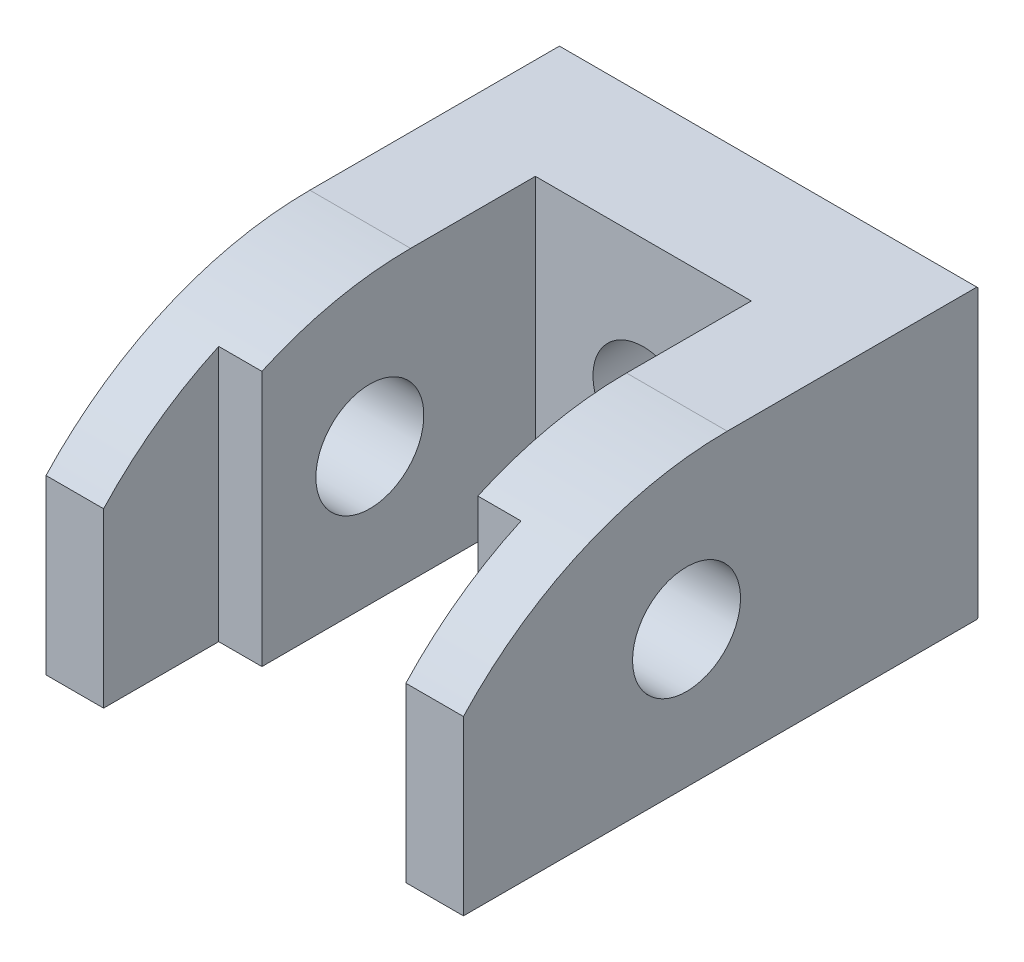
ISO-10303-21;
HEADER;
FILE_DESCRIPTION(('STEP AP214'),'2;1');
FILE_NAME('part.step','',(''),(''),'','','');
FILE_SCHEMA(('AUTOMOTIVE_DESIGN { 1 0 10303 214 1 1 1 1 }'));
ENDSEC;
DATA;
#1=APPLICATION_CONTEXT('core data for automotive mechanical design processes');
#2=APPLICATION_PROTOCOL_DEFINITION('international standard','automotive_design',2000,#1);
#3=PRODUCT_CONTEXT('',#1,'mechanical');
#4=PRODUCT('Part','Part','',(#3));
#5=PRODUCT_RELATED_PRODUCT_CATEGORY('part','',(#4));
#6=PRODUCT_DEFINITION_FORMATION('','',#4);
#7=PRODUCT_DEFINITION_CONTEXT('part definition',#1,'design');
#8=PRODUCT_DEFINITION('design','',#6,#7);
#9=PRODUCT_DEFINITION_SHAPE('','',#8);
#10=(LENGTH_UNIT() NAMED_UNIT(*) SI_UNIT(.MILLI.,.METRE.));
#11=(NAMED_UNIT(*) PLANE_ANGLE_UNIT() SI_UNIT($,.RADIAN.));
#12=(NAMED_UNIT(*) SI_UNIT($,.STERADIAN.) SOLID_ANGLE_UNIT());
#13=UNCERTAINTY_MEASURE_WITH_UNIT(LENGTH_MEASURE(1.E-05),#10,'distance_accuracy_value','');
#14=(GEOMETRIC_REPRESENTATION_CONTEXT(3) GLOBAL_UNCERTAINTY_ASSIGNED_CONTEXT((#13)) GLOBAL_UNIT_ASSIGNED_CONTEXT((#10,
#11,#12)) REPRESENTATION_CONTEXT('',''));
#15=CARTESIAN_POINT('',(0.,0.,0.));
#16=DIRECTION('',(0.,0.,1.));
#17=DIRECTION('',(1.,0.,0.));
#18=AXIS2_PLACEMENT_3D('',#15,#16,#17);
#19=CARTESIAN_POINT('',(0.,-10.,-71.5));
#20=DIRECTION('',(0.707106781186547,0.,0.707106781186548));
#21=DIRECTION('',(0.,-1.,0.));
#22=AXIS2_PLACEMENT_3D('',#19,#20,#21);
#23=PLANE('',#22);
#24=DIRECTION('',(0.,-1.,0.));
#25=VECTOR('',#24,1.);
#26=CARTESIAN_POINT('',(0.,-10.,-71.5));
#27=LINE('',#26,#25);
#28=CARTESIAN_POINT('',(0.,39.8397459621556,-71.5));
#29=VERTEX_POINT('',#28);
#30=CARTESIAN_POINT('',(0.,0.160254037844376,-71.5));
#31=VERTEX_POINT('',#30);
#32=EDGE_CURVE('E382',#29,#31,#27,.T.);
#33=ORIENTED_EDGE('',*,*,#32,.F.);
#34=DIRECTION('',(-0.577350269189625,0.577350269189627,0.577350269189625));
#35=VECTOR('',#34,1.);
#36=CARTESIAN_POINT('',(16.6132486540519,23.2264973081037,-88.1132486540519));
#37=LINE('',#36,#35);
#38=CARTESIAN_POINT('',(8.50000000000001,31.3397459621556,-80.));
#39=VERTEX_POINT('',#38);
#40=EDGE_CURVE('E60',#39,#29,#37,.T.);
#41=ORIENTED_EDGE('',*,*,#40,.F.);
#42=DIRECTION('',(0.,1.,0.));
#43=VECTOR('',#42,1.);
#44=CARTESIAN_POINT('',(8.5,8.66025403784441,-80.));
#45=LINE('',#44,#43);
#46=CARTESIAN_POINT('',(8.50000000000001,8.66025403784441,-80.));
#47=VERTEX_POINT('',#46);
#48=EDGE_CURVE('E386',#47,#39,#45,.T.);
#49=ORIENTED_EDGE('',*,*,#48,.F.);
#50=DIRECTION('',(0.577350269189625,0.577350269189627,-0.577350269189625));
#51=VECTOR('',#50,1.);
#52=CARTESIAN_POINT('',(-3.38675134594814,-3.22649730810376,-68.1132486540519));
#53=LINE('',#52,#51);
#54=EDGE_CURVE('E13',#31,#47,#53,.T.);
#55=ORIENTED_EDGE('',*,*,#54,.F.);
#56=EDGE_LOOP('',(#33,#41,#49,#55));
#57=FACE_BOUND('',#56,.T.);
#58=ADVANCED_FACE('F51',(#57),#23,.F.);
#59=CARTESIAN_POINT('',(49.5,8.66025403784441,-80.));
#60=DIRECTION('',(0.707106781186547,0.,-0.707106781186548));
#61=DIRECTION('',(0.,1.,0.));
#62=AXIS2_PLACEMENT_3D('',#59,#60,#61);
#63=PLANE('',#62);
#64=DIRECTION('',(0.,-1.,0.));
#65=VECTOR('',#64,1.);
#66=CARTESIAN_POINT('',(49.5,31.3397459621556,-80.));
#67=LINE('',#66,#65);
#68=CARTESIAN_POINT('',(49.5,31.3397459621556,-80.));
#69=VERTEX_POINT('',#68);
#70=CARTESIAN_POINT('',(49.5,8.66025403784441,-80.));
#71=VERTEX_POINT('',#70);
#72=EDGE_CURVE('E350',#69,#71,#67,.T.);
#73=ORIENTED_EDGE('',*,*,#72,.F.);
#74=DIRECTION('',(0.577350269189625,0.577350269189627,0.577350269189625));
#75=VECTOR('',#74,1.);
#76=CARTESIAN_POINT('',(41.9401693585629,23.7799153207185,-87.5598306414371));
#77=LINE('',#76,#75);
#78=CARTESIAN_POINT('',(58.,39.8397459621556,-71.5));
#79=VERTEX_POINT('',#78);
#80=EDGE_CURVE('E376',#79,#69,#77,.F.);
#81=ORIENTED_EDGE('',*,*,#80,.F.);
#82=DIRECTION('',(0.,1.,0.));
#83=VECTOR('',#82,1.);
#84=CARTESIAN_POINT('',(58.,31.3397459621556,-71.5));
#85=LINE('',#84,#83);
#86=CARTESIAN_POINT('',(58.,0.160254037844376,-71.5));
#87=VERTEX_POINT('',#86);
#88=EDGE_CURVE('E372',#87,#79,#85,.T.);
#89=ORIENTED_EDGE('',*,*,#88,.F.);
#90=DIRECTION('',(-0.577350269189625,0.577350269189627,-0.577350269189625));
#91=VECTOR('',#90,1.);
#92=CARTESIAN_POINT('',(49.5,8.66025403784441,-80.));
#93=LINE('',#92,#91);
#94=EDGE_CURVE('E379',#71,#87,#93,.F.);
#95=ORIENTED_EDGE('',*,*,#94,.F.);
#96=EDGE_LOOP('',(#73,#81,#89,#95));
#97=FACE_BOUND('',#96,.T.);
#98=ADVANCED_FACE('F409',(#97),#63,.T.);
#99=CARTESIAN_POINT('',(58.,-10.,-36.6606055596467));
#100=DIRECTION('',(-1.,0.,0.));
#101=DIRECTION('',(0.,0.,1.));
#102=AXIS2_PLACEMENT_3D('',#99,#100,#101);
#103=CYLINDRICAL_SURFACE('',#102,50.);
#104=DIRECTION('',(-1.,0.,0.));
#105=VECTOR('',#104,1.);
#106=CARTESIAN_POINT('',(58.,35.5317403347236,-16.));
#107=LINE('',#106,#105);
#108=CARTESIAN_POINT('',(44.,35.5317403347236,-16.));
#109=VERTEX_POINT('',#108);
#110=CARTESIAN_POINT('',(50.,35.5317403347236,-16.));
#111=VERTEX_POINT('',#110);
#112=EDGE_CURVE('E346',#109,#111,#107,.F.);
#113=ORIENTED_EDGE('',*,*,#112,.T.);
#114=CARTESIAN_POINT('',(50.,-10.,-36.6606055596467));
#115=DIRECTION('',(1.,0.,0.));
#116=DIRECTION('',(0.,0.,-1.));
#117=AXIS2_PLACEMENT_3D('',#114,#115,#116);
#118=CIRCLE('',#117,50.);
#119=CARTESIAN_POINT('',(50.,24.,0.));
#120=VERTEX_POINT('',#119);
#121=EDGE_CURVE('E256',#111,#120,#118,.T.);
#122=ORIENTED_EDGE('',*,*,#121,.T.);
#123=DIRECTION('',(-1.,0.,0.));
#124=VECTOR('',#123,1.);
#125=CARTESIAN_POINT('',(58.,24.,0.));
#126=LINE('',#125,#124);
#127=CARTESIAN_POINT('',(58.,24.,0.));
#128=VERTEX_POINT('',#127);
#129=EDGE_CURVE('E310',#128,#120,#126,.T.);
#130=ORIENTED_EDGE('',*,*,#129,.F.);
#131=CARTESIAN_POINT('',(58.,-10.,-36.6606055596467));
#132=DIRECTION('',(1.,0.,0.));
#133=DIRECTION('',(0.,0.,-1.));
#134=AXIS2_PLACEMENT_3D('',#131,#132,#133);
#135=CIRCLE('',#134,50.);
#136=CARTESIAN_POINT('',(58.,40.,-36.6606055596467));
#137=VERTEX_POINT('',#136);
#138=EDGE_CURVE('E282',#137,#128,#135,.T.);
#139=ORIENTED_EDGE('',*,*,#138,.F.);
#140=DIRECTION('',(-1.,0.,0.));
#141=VECTOR('',#140,1.);
#142=CARTESIAN_POINT('',(58.,40.,-36.6606055596467));
#143=LINE('',#142,#141);
#144=CARTESIAN_POINT('',(44.,40.,-36.6606055596467));
#145=VERTEX_POINT('',#144);
#146=EDGE_CURVE('E314',#137,#145,#143,.T.);
#147=ORIENTED_EDGE('',*,*,#146,.T.);
#148=CARTESIAN_POINT('',(44.,-10.,-36.6606055596467));
#149=DIRECTION('',(1.,0.,0.));
#150=DIRECTION('',(0.,0.,-1.));
#151=AXIS2_PLACEMENT_3D('',#148,#149,#150);
#152=CIRCLE('',#151,50.);
#153=EDGE_CURVE('E252',#145,#109,#152,.T.);
#154=ORIENTED_EDGE('',*,*,#153,.T.);
#155=EDGE_LOOP('',(#113,#122,#130,#139,#147,#154));
#156=FACE_BOUND('',#155,.T.);
#157=ADVANCED_FACE('F443',(#156),#103,.T.);
#158=CARTESIAN_POINT('',(58.,0.,0.));
#159=DIRECTION('',(0.,0.,-1.));
#160=DIRECTION('',(-1.,0.,0.));
#161=AXIS2_PLACEMENT_3D('',#158,#159,#160);
#162=PLANE('',#161);
#163=DIRECTION('',(-1.,0.,0.));
#164=VECTOR('',#163,1.);
#165=CARTESIAN_POINT('',(58.,0.,0.));
#166=LINE('',#165,#164);
#167=CARTESIAN_POINT('',(8.,0.,0.));
#168=VERTEX_POINT('',#167);
#169=CARTESIAN_POINT('',(0.,0.,0.));
#170=VERTEX_POINT('',#169);
#171=EDGE_CURVE('E289',#168,#170,#166,.T.);
#172=ORIENTED_EDGE('',*,*,#171,.F.);
#173=DIRECTION('',(0.,1.,0.));
#174=VECTOR('',#173,1.);
#175=CARTESIAN_POINT('',(8.,0.,0.));
#176=LINE('',#175,#174);
#177=CARTESIAN_POINT('',(8.,24.,0.));
#178=VERTEX_POINT('',#177);
#179=EDGE_CURVE('E338',#168,#178,#176,.T.);
#180=ORIENTED_EDGE('',*,*,#179,.T.);
#181=CARTESIAN_POINT('',(0.,24.,0.));
#182=VERTEX_POINT('',#181);
#183=EDGE_CURVE('E309',#178,#182,#126,.T.);
#184=ORIENTED_EDGE('',*,*,#183,.T.);
#185=DIRECTION('',(0.,-1.,0.));
#186=VECTOR('',#185,1.);
#187=CARTESIAN_POINT('',(0.,0.,0.));
#188=LINE('',#187,#186);
#189=EDGE_CURVE('E278',#182,#170,#188,.T.);
#190=ORIENTED_EDGE('',*,*,#189,.T.);
#191=EDGE_LOOP('',(#172,#180,#184,#190));
#192=FACE_BOUND('',#191,.T.);
#193=ADVANCED_FACE('F424',(#192),#162,.F.);
#194=CARTESIAN_POINT('',(58.,19.,-31.));
#195=DIRECTION('',(-1.,0.,0.));
#196=DIRECTION('',(0.,0.,1.));
#197=AXIS2_PLACEMENT_3D('',#194,#195,#196);
#198=CYLINDRICAL_SURFACE('',#197,7.5);
#199=CARTESIAN_POINT('',(44.,19.,-31.));
#200=DIRECTION('',(1.,0.,0.));
#201=DIRECTION('',(0.,0.,-1.));
#202=AXIS2_PLACEMENT_3D('',#199,#200,#201);
#203=CIRCLE('',#202,7.5);
#204=CARTESIAN_POINT('',(44.,19.,-23.5));
#205=VERTEX_POINT('',#204);
#206=EDGE_CURVE('E251',#205,#205,#203,.T.);
#207=CARTESIAN_POINT('',(58.,19.,-31.));
#208=DIRECTION('',(1.,0.,0.));
#209=DIRECTION('',(0.,0.,-1.));
#210=AXIS2_PLACEMENT_3D('',#207,#208,#209);
#211=CIRCLE('',#210,7.5);
#212=CARTESIAN_POINT('',(58.,19.,-23.5));
#213=VERTEX_POINT('',#212);
#214=EDGE_CURVE('E265',#213,#213,#211,.T.);
#215=CARTESIAN_POINT('',(44.,19.,-23.5));
#216=CARTESIAN_POINT('',(44.1458333333333,19.,-23.5));
#217=CARTESIAN_POINT('',(44.2916666666667,19.,-23.5));
#218=CARTESIAN_POINT('',(44.5833333333333,19.,-23.5));
#219=CARTESIAN_POINT('',(44.7291666666667,19.,-23.5));
#220=CARTESIAN_POINT('',(45.0208333333333,19.,-23.5));
#221=CARTESIAN_POINT('',(45.1666666666667,19.,-23.5));
#222=CARTESIAN_POINT('',(45.4583333333333,19.,-23.5));
#223=CARTESIAN_POINT('',(45.6041666666667,19.,-23.5));
#224=CARTESIAN_POINT('',(45.8958333333333,19.,-23.5));
#225=CARTESIAN_POINT('',(46.0416666666667,19.,-23.5));
#226=CARTESIAN_POINT('',(46.3333333333333,19.,-23.5));
#227=CARTESIAN_POINT('',(46.4791666666667,19.,-23.5));
#228=CARTESIAN_POINT('',(46.7708333333333,19.,-23.5));
#229=CARTESIAN_POINT('',(46.9166666666667,19.,-23.5));
#230=CARTESIAN_POINT('',(47.2083333333333,19.,-23.5));
#231=CARTESIAN_POINT('',(47.3541666666667,19.,-23.5));
#232=CARTESIAN_POINT('',(47.6458333333333,19.,-23.5));
#233=CARTESIAN_POINT('',(47.7916666666667,19.,-23.5));
#234=CARTESIAN_POINT('',(48.0833333333333,19.,-23.5));
#235=CARTESIAN_POINT('',(48.2291666666667,19.,-23.5));
#236=CARTESIAN_POINT('',(48.5208333333333,19.,-23.5));
#237=CARTESIAN_POINT('',(48.6666666666667,19.,-23.5));
#238=CARTESIAN_POINT('',(48.9583333333333,19.,-23.5));
#239=CARTESIAN_POINT('',(49.1041666666667,19.,-23.5));
#240=CARTESIAN_POINT('',(49.3958333333333,19.,-23.5));
#241=CARTESIAN_POINT('',(49.5416666666667,19.,-23.5));
#242=CARTESIAN_POINT('',(49.8333333333333,19.,-23.5));
#243=CARTESIAN_POINT('',(49.9791666666667,19.,-23.5));
#244=CARTESIAN_POINT('',(50.2708333333333,19.,-23.5));
#245=CARTESIAN_POINT('',(50.4166666666667,19.,-23.5));
#246=CARTESIAN_POINT('',(50.7083333333333,19.,-23.5));
#247=CARTESIAN_POINT('',(50.8541666666667,19.,-23.5));
#248=CARTESIAN_POINT('',(51.1458333333333,19.,-23.5));
#249=CARTESIAN_POINT('',(51.2916666666667,19.,-23.5));
#250=CARTESIAN_POINT('',(51.5833333333333,19.,-23.5));
#251=CARTESIAN_POINT('',(51.7291666666667,19.,-23.5));
#252=CARTESIAN_POINT('',(52.0208333333333,19.,-23.5));
#253=CARTESIAN_POINT('',(52.1666666666667,19.,-23.5));
#254=CARTESIAN_POINT('',(52.4583333333333,19.,-23.5));
#255=CARTESIAN_POINT('',(52.6041666666667,19.,-23.5));
#256=CARTESIAN_POINT('',(52.8958333333333,19.,-23.5));
#257=CARTESIAN_POINT('',(53.0416666666667,19.,-23.5));
#258=CARTESIAN_POINT('',(53.3333333333333,19.,-23.5));
#259=CARTESIAN_POINT('',(53.4791666666667,19.,-23.5));
#260=CARTESIAN_POINT('',(53.7708333333333,19.,-23.5));
#261=CARTESIAN_POINT('',(53.9166666666667,19.,-23.5));
#262=CARTESIAN_POINT('',(54.2083333333333,19.,-23.5));
#263=CARTESIAN_POINT('',(54.3541666666667,19.,-23.5));
#264=CARTESIAN_POINT('',(54.6458333333333,19.,-23.5));
#265=CARTESIAN_POINT('',(54.7916666666667,19.,-23.5));
#266=CARTESIAN_POINT('',(55.0833333333333,19.,-23.5));
#267=CARTESIAN_POINT('',(55.2291666666667,19.,-23.5));
#268=CARTESIAN_POINT('',(55.5208333333333,19.,-23.5));
#269=CARTESIAN_POINT('',(55.6666666666667,19.,-23.5));
#270=CARTESIAN_POINT('',(55.9583333333333,19.,-23.5));
#271=CARTESIAN_POINT('',(56.1041666666667,19.,-23.5));
#272=CARTESIAN_POINT('',(56.3958333333333,19.,-23.5));
#273=CARTESIAN_POINT('',(56.5416666666667,19.,-23.5));
#274=CARTESIAN_POINT('',(56.8333333333333,19.,-23.5));
#275=CARTESIAN_POINT('',(56.9791666666667,19.,-23.5));
#276=CARTESIAN_POINT('',(57.2708333333333,19.,-23.5));
#277=CARTESIAN_POINT('',(57.4166666666667,19.,-23.5));
#278=CARTESIAN_POINT('',(57.7083333333333,19.,-23.5));
#279=CARTESIAN_POINT('',(57.8541666666667,19.,-23.5));
#280=CARTESIAN_POINT('',(58.,19.,-23.5));
#281=B_SPLINE_CURVE_WITH_KNOTS('',3,(#215,#216,#217,#218,#219,#220,#221,#222,#223,#224,#225,
#226,#227,#228,#229,#230,#231,#232,#233,#234,#235,#236,#237,#238,#239,#240,#241,#242,#243,#244,
#245,#246,#247,#248,#249,#250,#251,#252,#253,#254,#255,#256,#257,#258,#259,#260,#261,#262,#263,
#264,#265,#266,#267,#268,#269,#270,#271,#272,#273,#274,#275,#276,#277,#278,#279,#280),
.UNSPECIFIED.,.F.,.F.,(4,2,2,2,2,2,2,2,2,2,2,2,2,2,2,2,2,2,2,2,2,2,2,2,2,2,2,2,2,2,2,2,4),(0.,
0.4375,0.875000000000001,1.3125,1.75,2.1875,2.625,3.0625,3.5,3.9375,4.375,4.8125,5.25,5.6875,
6.125,6.5625,7.,7.4375,7.875,8.3125,8.75,9.18749999999999,9.62499999999999,10.0625,10.5,10.9375,
11.375,11.8125,12.25,12.6875,13.125,13.5625,14.),.UNSPECIFIED.);
#282=EDGE_CURVE('BSEAM463',#205,#213,#281,.T.);
#283=ORIENTED_EDGE('',*,*,#206,.F.);
#284=ORIENTED_EDGE('',*,*,#214,.T.);
#285=ORIENTED_EDGE('',*,*,#282,.T.);
#286=ORIENTED_EDGE('',*,*,#282,.F.);
#287=EDGE_LOOP('',(#283,#285,#284,#286));
#288=FACE_BOUND('',#287,.T.);
#289=ADVANCED_FACE('F463',(#288),#198,.F.);
#290=CARTESIAN_POINT('',(58.,-10.,-36.6606055596467));
#291=DIRECTION('',(1.,0.,0.));
#292=DIRECTION('',(0.,0.,-1.));
#293=AXIS2_PLACEMENT_3D('',#290,#291,#292);
#294=PLANE('',#293);
#295=DIRECTION('',(0.,-0.707106781186549,0.707106781186546));
#296=VECTOR('',#295,1.);
#297=CARTESIAN_POINT('',(58.,8.66025403784441,-80.));
#298=LINE('',#297,#296);
#299=CARTESIAN_POINT('',(58.,0.,-71.3397459621556));
#300=VERTEX_POINT('',#299);
#301=EDGE_CURVE('E277',#300,#87,#298,.F.);
#302=ORIENTED_EDGE('',*,*,#301,.T.);
#303=ORIENTED_EDGE('',*,*,#88,.T.);
#304=DIRECTION('',(0.,-0.707106781186549,-0.707106781186546));
#305=VECTOR('',#304,1.);
#306=CARTESIAN_POINT('',(58.,31.3397459621556,-80.));
#307=LINE('',#306,#305);
#308=CARTESIAN_POINT('',(58.,40.,-71.3397459621556));
#309=VERTEX_POINT('',#308);
#310=EDGE_CURVE('E283',#79,#309,#307,.F.);
#311=ORIENTED_EDGE('',*,*,#310,.T.);
#312=DIRECTION('',(0.,0.,1.));
#313=VECTOR('',#312,1.);
#314=CARTESIAN_POINT('',(58.,40.,-65.));
#315=LINE('',#314,#313);
#316=EDGE_CURVE('E279',#309,#137,#315,.T.);
#317=ORIENTED_EDGE('',*,*,#316,.T.);
#318=ORIENTED_EDGE('',*,*,#138,.T.);
#319=DIRECTION('',(0.,-1.,0.));
#320=VECTOR('',#319,1.);
#321=CARTESIAN_POINT('',(58.,0.,0.));
#322=LINE('',#321,#320);
#323=CARTESIAN_POINT('',(58.,0.,0.));
#324=VERTEX_POINT('',#323);
#325=EDGE_CURVE('E286',#128,#324,#322,.T.);
#326=ORIENTED_EDGE('',*,*,#325,.T.);
#327=DIRECTION('',(0.,0.,-1.));
#328=VECTOR('',#327,1.);
#329=CARTESIAN_POINT('',(58.,0.,0.));
#330=LINE('',#329,#328);
#331=EDGE_CURVE('E273',#324,#300,#330,.T.);
#332=ORIENTED_EDGE('',*,*,#331,.T.);
#333=EDGE_LOOP('',(#302,#303,#311,#317,#318,#326,#332));
#334=FACE_BOUND('',#333,.T.);
#335=ORIENTED_EDGE('',*,*,#214,.F.);
#336=EDGE_LOOP('',(#335));
#337=FACE_BOUND('',#336,.T.);
#338=ADVANCED_FACE('F405',(#334,#337),#294,.T.);
#339=CARTESIAN_POINT('',(0.,-10.,-36.6606055596467));
#340=DIRECTION('',(1.,0.,0.));
#341=DIRECTION('',(0.,0.,-1.));
#342=AXIS2_PLACEMENT_3D('',#339,#340,#341);
#343=PLANE('',#342);
#344=DIRECTION('',(0.,-0.707106781186549,-0.707106781186546));
#345=VECTOR('',#344,1.);
#346=CARTESIAN_POINT('',(0.,31.3397459621556,-80.));
#347=LINE('',#346,#345);
#348=CARTESIAN_POINT('',(0.,40.,-71.3397459621556));
#349=VERTEX_POINT('',#348);
#350=EDGE_CURVE('E298',#29,#349,#347,.F.);
#351=ORIENTED_EDGE('',*,*,#350,.F.);
#352=ORIENTED_EDGE('',*,*,#32,.T.);
#353=DIRECTION('',(0.,-0.707106781186549,0.707106781186546));
#354=VECTOR('',#353,1.);
#355=CARTESIAN_POINT('',(0.,8.66025403784441,-80.));
#356=LINE('',#355,#354);
#357=CARTESIAN_POINT('',(0.,0.,-71.3397459621556));
#358=VERTEX_POINT('',#357);
#359=EDGE_CURVE('E293',#358,#31,#356,.F.);
#360=ORIENTED_EDGE('',*,*,#359,.F.);
#361=DIRECTION('',(0.,0.,-1.));
#362=VECTOR('',#361,1.);
#363=CARTESIAN_POINT('',(0.,0.,0.));
#364=LINE('',#363,#362);
#365=EDGE_CURVE('E269',#170,#358,#364,.T.);
#366=ORIENTED_EDGE('',*,*,#365,.F.);
#367=ORIENTED_EDGE('',*,*,#189,.F.);
#368=CARTESIAN_POINT('',(0.,-10.,-36.6606055596467));
#369=DIRECTION('',(1.,0.,0.));
#370=DIRECTION('',(0.,0.,-1.));
#371=AXIS2_PLACEMENT_3D('',#368,#369,#370);
#372=CIRCLE('',#371,50.);
#373=CARTESIAN_POINT('',(0.,40.,-36.6606055596467));
#374=VERTEX_POINT('',#373);
#375=EDGE_CURVE('E297',#374,#182,#372,.T.);
#376=ORIENTED_EDGE('',*,*,#375,.F.);
#377=DIRECTION('',(0.,0.,1.));
#378=VECTOR('',#377,1.);
#379=CARTESIAN_POINT('',(0.,40.,-65.));
#380=LINE('',#379,#378);
#381=EDGE_CURVE('E294',#349,#374,#380,.T.);
#382=ORIENTED_EDGE('',*,*,#381,.F.);
#383=EDGE_LOOP('',(#351,#352,#360,#366,#367,#376,#382));
#384=FACE_BOUND('',#383,.T.);
#385=CARTESIAN_POINT('',(0.,19.,-31.));
#386=DIRECTION('',(1.,0.,0.));
#387=DIRECTION('',(0.,0.,-1.));
#388=AXIS2_PLACEMENT_3D('',#385,#386,#387);
#389=CIRCLE('',#388,7.5);
#390=CARTESIAN_POINT('',(0.,19.,-23.5));
#391=VERTEX_POINT('',#390);
#392=EDGE_CURVE('E264',#391,#391,#389,.T.);
#393=ORIENTED_EDGE('',*,*,#392,.T.);
#394=EDGE_LOOP('',(#393));
#395=FACE_BOUND('',#394,.T.);
#396=ADVANCED_FACE('F396',(#384,#395),#343,.F.);
#397=CARTESIAN_POINT('',(58.,0.,0.));
#398=DIRECTION('',(0.,1.,0.));
#399=DIRECTION('',(0.,0.,1.));
#400=AXIS2_PLACEMENT_3D('',#397,#398,#399);
#401=PLANE('',#400);
#402=DIRECTION('',(1.,0.,0.));
#403=VECTOR('',#402,1.);
#404=CARTESIAN_POINT('',(8.,0.,-16.));
#405=LINE('',#404,#403);
#406=CARTESIAN_POINT('',(8.,0.,-16.));
#407=VERTEX_POINT('',#406);
#408=CARTESIAN_POINT('',(14.,0.,-16.));
#409=VERTEX_POINT('',#408);
#410=EDGE_CURVE('E218',#407,#409,#405,.T.);
#411=ORIENTED_EDGE('',*,*,#410,.F.);
#412=DIRECTION('',(0.,0.,-1.));
#413=VECTOR('',#412,1.);
#414=CARTESIAN_POINT('',(8.,0.,0.));
#415=LINE('',#414,#413);
#416=EDGE_CURVE('E214',#168,#407,#415,.T.);
#417=ORIENTED_EDGE('',*,*,#416,.F.);
#418=ORIENTED_EDGE('',*,*,#171,.T.);
#419=ORIENTED_EDGE('',*,*,#365,.T.);
#420=DIRECTION('',(1.,0.,0.));
#421=VECTOR('',#420,1.);
#422=CARTESIAN_POINT('',(58.,0.,-71.3397459621556));
#423=LINE('',#422,#421);
#424=EDGE_CURVE('E327',#300,#358,#423,.F.);
#425=ORIENTED_EDGE('',*,*,#424,.F.);
#426=ORIENTED_EDGE('',*,*,#331,.F.);
#427=CARTESIAN_POINT('',(50.,0.,0.));
#428=VERTEX_POINT('',#427);
#429=EDGE_CURVE('E305',#324,#428,#166,.T.);
#430=ORIENTED_EDGE('',*,*,#429,.T.);
#431=DIRECTION('',(0.,0.,1.));
#432=VECTOR('',#431,1.);
#433=CARTESIAN_POINT('',(50.,0.,0.));
#434=LINE('',#433,#432);
#435=CARTESIAN_POINT('',(50.,0.,-16.));
#436=VERTEX_POINT('',#435);
#437=EDGE_CURVE('E203',#436,#428,#434,.T.);
#438=ORIENTED_EDGE('',*,*,#437,.F.);
#439=DIRECTION('',(1.,0.,0.));
#440=VECTOR('',#439,1.);
#441=CARTESIAN_POINT('',(44.,0.,-16.));
#442=LINE('',#441,#440);
#443=CARTESIAN_POINT('',(44.,0.,-16.));
#444=VERTEX_POINT('',#443);
#445=EDGE_CURVE('E206',#444,#436,#442,.T.);
#446=ORIENTED_EDGE('',*,*,#445,.F.);
#447=DIRECTION('',(0.,0.,1.));
#448=VECTOR('',#447,1.);
#449=CARTESIAN_POINT('',(44.,0.,-16.));
#450=LINE('',#449,#448);
#451=CARTESIAN_POINT('',(44.,0.,-54.));
#452=VERTEX_POINT('',#451);
#453=EDGE_CURVE('E228',#452,#444,#450,.T.);
#454=ORIENTED_EDGE('',*,*,#453,.F.);
#455=DIRECTION('',(1.,0.,0.));
#456=VECTOR('',#455,1.);
#457=CARTESIAN_POINT('',(14.,0.,-54.));
#458=LINE('',#457,#456);
#459=CARTESIAN_POINT('',(14.,0.,-54.));
#460=VERTEX_POINT('',#459);
#461=EDGE_CURVE('E225',#460,#452,#458,.T.);
#462=ORIENTED_EDGE('',*,*,#461,.F.);
#463=DIRECTION('',(0.,0.,-1.));
#464=VECTOR('',#463,1.);
#465=CARTESIAN_POINT('',(14.,0.,-16.));
#466=LINE('',#465,#464);
#467=EDGE_CURVE('E181',#409,#460,#466,.T.);
#468=ORIENTED_EDGE('',*,*,#467,.F.);
#469=EDGE_LOOP('',(#411,#417,#418,#419,#425,#426,#430,#438,#446,#454,#462,#468));
#470=FACE_BOUND('',#469,.T.);
#471=ADVANCED_FACE('F419',(#470),#401,.F.);
#472=CARTESIAN_POINT('',(58.,8.66025403784441,-80.));
#473=DIRECTION('',(0.,-0.707106781186546,-0.707106781186549));
#474=DIRECTION('',(0.,0.707106781186549,-0.707106781186546));
#475=AXIS2_PLACEMENT_3D('',#472,#473,#474);
#476=PLANE('',#475);
#477=ORIENTED_EDGE('',*,*,#359,.T.);
#478=ORIENTED_EDGE('',*,*,#54,.T.);
#479=DIRECTION('',(-1.,0.,0.));
#480=VECTOR('',#479,1.);
#481=CARTESIAN_POINT('',(58.,8.66025403784441,-80.));
#482=LINE('',#481,#480);
#483=EDGE_CURVE('E323',#71,#47,#482,.T.);
#484=ORIENTED_EDGE('',*,*,#483,.F.);
#485=ORIENTED_EDGE('',*,*,#94,.T.);
#486=ORIENTED_EDGE('',*,*,#301,.F.);
#487=ORIENTED_EDGE('',*,*,#424,.T.);
#488=EDGE_LOOP('',(#477,#478,#484,#485,#486,#487));
#489=FACE_BOUND('',#488,.T.);
#490=ADVANCED_FACE('F412',(#489),#476,.T.);
#491=CARTESIAN_POINT('',(58.,8.66025403784441,-80.));
#492=DIRECTION('',(0.,0.,1.));
#493=DIRECTION('',(1.,0.,0.));
#494=AXIS2_PLACEMENT_3D('',#491,#492,#493);
#495=PLANE('',#494);
#496=CARTESIAN_POINT('',(29.,20.,-80.));
#497=DIRECTION('',(0.,0.,-1.));
#498=DIRECTION('',(-1.,0.,0.));
#499=AXIS2_PLACEMENT_3D('',#496,#497,#498);
#500=CIRCLE('',#499,7.);
#501=CARTESIAN_POINT('',(22.,20.,-80.));
#502=VERTEX_POINT('',#501);
#503=EDGE_CURVE('E209',#502,#502,#500,.T.);
#504=ORIENTED_EDGE('',*,*,#503,.F.);
#505=EDGE_LOOP('',(#504));
#506=FACE_BOUND('',#505,.T.);
#507=ORIENTED_EDGE('',*,*,#483,.T.);
#508=ORIENTED_EDGE('',*,*,#48,.T.);
#509=DIRECTION('',(-1.,0.,0.));
#510=VECTOR('',#509,1.);
#511=CARTESIAN_POINT('',(58.,31.3397459621556,-80.));
#512=LINE('',#511,#510);
#513=EDGE_CURVE('E319',#69,#39,#512,.T.);
#514=ORIENTED_EDGE('',*,*,#513,.F.);
#515=ORIENTED_EDGE('',*,*,#72,.T.);
#516=EDGE_LOOP('',(#507,#508,#514,#515));
#517=FACE_BOUND('',#516,.T.);
#518=ADVANCED_FACE('F411',(#506,#517),#495,.F.);
#519=CARTESIAN_POINT('',(58.,31.3397459621556,-80.));
#520=DIRECTION('',(0.,0.707106781186546,-0.707106781186549));
#521=DIRECTION('',(0.,0.707106781186549,0.707106781186546));
#522=AXIS2_PLACEMENT_3D('',#519,#520,#521);
#523=PLANE('',#522);
#524=ORIENTED_EDGE('',*,*,#513,.T.);
#525=ORIENTED_EDGE('',*,*,#40,.T.);
#526=ORIENTED_EDGE('',*,*,#350,.T.);
#527=DIRECTION('',(1.,0.,0.));
#528=VECTOR('',#527,1.);
#529=CARTESIAN_POINT('',(58.,40.,-71.3397459621556));
#530=LINE('',#529,#528);
#531=EDGE_CURVE('E318',#309,#349,#530,.F.);
#532=ORIENTED_EDGE('',*,*,#531,.F.);
#533=ORIENTED_EDGE('',*,*,#310,.F.);
#534=ORIENTED_EDGE('',*,*,#80,.T.);
#535=EDGE_LOOP('',(#524,#525,#526,#532,#533,#534));
#536=FACE_BOUND('',#535,.T.);
#537=ADVANCED_FACE('F390',(#536),#523,.T.);
#538=CARTESIAN_POINT('',(58.,40.,-65.));
#539=DIRECTION('',(0.,-1.,0.));
#540=DIRECTION('',(0.,0.,-1.));
#541=AXIS2_PLACEMENT_3D('',#538,#539,#540);
#542=PLANE('',#541);
#543=DIRECTION('',(1.,0.,0.));
#544=VECTOR('',#543,1.);
#545=CARTESIAN_POINT('',(14.,40.,-54.));
#546=LINE('',#545,#544);
#547=CARTESIAN_POINT('',(14.,40.,-54.));
#548=VERTEX_POINT('',#547);
#549=CARTESIAN_POINT('',(44.,40.,-54.));
#550=VERTEX_POINT('',#549);
#551=EDGE_CURVE('E190',#548,#550,#546,.T.);
#552=ORIENTED_EDGE('',*,*,#551,.T.);
#553=DIRECTION('',(0.,0.,1.));
#554=VECTOR('',#553,1.);
#555=CARTESIAN_POINT('',(44.,40.,-16.));
#556=LINE('',#555,#554);
#557=EDGE_CURVE('E196',#550,#145,#556,.T.);
#558=ORIENTED_EDGE('',*,*,#557,.T.);
#559=ORIENTED_EDGE('',*,*,#146,.F.);
#560=ORIENTED_EDGE('',*,*,#316,.F.);
#561=ORIENTED_EDGE('',*,*,#531,.T.);
#562=ORIENTED_EDGE('',*,*,#381,.T.);
#563=CARTESIAN_POINT('',(14.,40.,-36.6606055596467));
#564=VERTEX_POINT('',#563);
#565=EDGE_CURVE('E201',#564,#374,#143,.T.);
#566=ORIENTED_EDGE('',*,*,#565,.F.);
#567=DIRECTION('',(0.,0.,-1.));
#568=VECTOR('',#567,1.);
#569=CARTESIAN_POINT('',(14.,40.,-16.));
#570=LINE('',#569,#568);
#571=EDGE_CURVE('E178',#564,#548,#570,.T.);
#572=ORIENTED_EDGE('',*,*,#571,.T.);
#573=EDGE_LOOP('',(#552,#558,#559,#560,#561,#562,#566,#572));
#574=FACE_BOUND('',#573,.T.);
#575=ADVANCED_FACE('F199',(#574),#542,.F.);
#576=ORIENTED_EDGE('',*,*,#183,.F.);
#577=CARTESIAN_POINT('',(8.00000000000001,-10.,-36.6606055596467));
#578=DIRECTION('',(-1.,0.,0.));
#579=DIRECTION('',(0.,0.,1.));
#580=AXIS2_PLACEMENT_3D('',#577,#578,#579);
#581=CIRCLE('',#580,50.);
#582=CARTESIAN_POINT('',(8.,35.5317403347236,-16.));
#583=VERTEX_POINT('',#582);
#584=EDGE_CURVE('E260',#178,#583,#581,.T.);
#585=ORIENTED_EDGE('',*,*,#584,.T.);
#586=DIRECTION('',(-1.,0.,0.));
#587=VECTOR('',#586,1.);
#588=CARTESIAN_POINT('',(58.,35.5317403347236,-16.));
#589=LINE('',#588,#587);
#590=CARTESIAN_POINT('',(14.,35.5317403347236,-16.));
#591=VERTEX_POINT('',#590);
#592=EDGE_CURVE('E342',#583,#591,#589,.F.);
#593=ORIENTED_EDGE('',*,*,#592,.T.);
#594=CARTESIAN_POINT('',(14.,-10.,-36.6606055596467));
#595=DIRECTION('',(-1.,0.,0.));
#596=DIRECTION('',(0.,0.,1.));
#597=AXIS2_PLACEMENT_3D('',#594,#595,#596);
#598=CIRCLE('',#597,50.);
#599=EDGE_CURVE('E248',#591,#564,#598,.T.);
#600=ORIENTED_EDGE('',*,*,#599,.T.);
#601=ORIENTED_EDGE('',*,*,#565,.T.);
#602=ORIENTED_EDGE('',*,*,#375,.T.);
#603=EDGE_LOOP('',(#576,#585,#593,#600,#601,#602));
#604=FACE_BOUND('',#603,.T.);
#605=ADVANCED_FACE('F428',(#604),#103,.T.);
#606=ORIENTED_EDGE('',*,*,#129,.T.);
#607=DIRECTION('',(0.,-1.,0.));
#608=VECTOR('',#607,1.);
#609=CARTESIAN_POINT('',(50.,0.,0.));
#610=LINE('',#609,#608);
#611=EDGE_CURVE('E334',#120,#428,#610,.T.);
#612=ORIENTED_EDGE('',*,*,#611,.T.);
#613=ORIENTED_EDGE('',*,*,#429,.F.);
#614=ORIENTED_EDGE('',*,*,#325,.F.);
#615=EDGE_LOOP('',(#606,#612,#613,#614));
#616=FACE_BOUND('',#615,.T.);
#617=ADVANCED_FACE('F446',(#616),#162,.F.);
#618=CARTESIAN_POINT('',(14.,19.,-31.));
#619=DIRECTION('',(-1.,0.,0.));
#620=DIRECTION('',(0.,0.,1.));
#621=AXIS2_PLACEMENT_3D('',#618,#619,#620);
#622=CIRCLE('',#621,7.5);
#623=CARTESIAN_POINT('',(14.,19.,-23.5));
#624=VERTEX_POINT('',#623);
#625=EDGE_CURVE('E238',#624,#624,#622,.T.);
#626=CARTESIAN_POINT('',(14.,19.,-23.5));
#627=CARTESIAN_POINT('',(13.8541666666667,19.,-23.5));
#628=CARTESIAN_POINT('',(13.7083333333333,19.,-23.5));
#629=CARTESIAN_POINT('',(13.4166666666667,19.,-23.5));
#630=CARTESIAN_POINT('',(13.2708333333333,19.,-23.5));
#631=CARTESIAN_POINT('',(12.9791666666667,19.,-23.5));
#632=CARTESIAN_POINT('',(12.8333333333333,19.,-23.5));
#633=CARTESIAN_POINT('',(12.5416666666667,19.,-23.5));
#634=CARTESIAN_POINT('',(12.3958333333333,19.,-23.5));
#635=CARTESIAN_POINT('',(12.1041666666667,19.,-23.5));
#636=CARTESIAN_POINT('',(11.9583333333333,19.,-23.5));
#637=CARTESIAN_POINT('',(11.6666666666667,19.,-23.5));
#638=CARTESIAN_POINT('',(11.5208333333333,19.,-23.5));
#639=CARTESIAN_POINT('',(11.2291666666667,19.,-23.5));
#640=CARTESIAN_POINT('',(11.0833333333333,19.,-23.5));
#641=CARTESIAN_POINT('',(10.7916666666667,19.,-23.5));
#642=CARTESIAN_POINT('',(10.6458333333333,19.,-23.5));
#643=CARTESIAN_POINT('',(10.3541666666667,19.,-23.5));
#644=CARTESIAN_POINT('',(10.2083333333333,19.,-23.5));
#645=CARTESIAN_POINT('',(9.91666666666667,19.,-23.5));
#646=CARTESIAN_POINT('',(9.77083333333333,19.,-23.5));
#647=CARTESIAN_POINT('',(9.47916666666667,19.,-23.5));
#648=CARTESIAN_POINT('',(9.33333333333333,19.,-23.5));
#649=CARTESIAN_POINT('',(9.04166666666667,19.,-23.5));
#650=CARTESIAN_POINT('',(8.89583333333333,19.,-23.5));
#651=CARTESIAN_POINT('',(8.60416666666667,19.,-23.5));
#652=CARTESIAN_POINT('',(8.45833333333333,19.,-23.5));
#653=CARTESIAN_POINT('',(8.16666666666667,19.,-23.5));
#654=CARTESIAN_POINT('',(8.02083333333333,19.,-23.5));
#655=CARTESIAN_POINT('',(7.72916666666667,19.,-23.5));
#656=CARTESIAN_POINT('',(7.58333333333333,19.,-23.5));
#657=CARTESIAN_POINT('',(7.29166666666667,19.,-23.5));
#658=CARTESIAN_POINT('',(7.14583333333333,19.,-23.5));
#659=CARTESIAN_POINT('',(6.85416666666667,19.,-23.5));
#660=CARTESIAN_POINT('',(6.70833333333333,19.,-23.5));
#661=CARTESIAN_POINT('',(6.41666666666667,19.,-23.5));
#662=CARTESIAN_POINT('',(6.27083333333333,19.,-23.5));
#663=CARTESIAN_POINT('',(5.97916666666667,19.,-23.5));
#664=CARTESIAN_POINT('',(5.83333333333333,19.,-23.5));
#665=CARTESIAN_POINT('',(5.54166666666666,19.,-23.5));
#666=CARTESIAN_POINT('',(5.39583333333333,19.,-23.5));
#667=CARTESIAN_POINT('',(5.10416666666666,19.,-23.5));
#668=CARTESIAN_POINT('',(4.95833333333333,19.,-23.5));
#669=CARTESIAN_POINT('',(4.66666666666667,19.,-23.5));
#670=CARTESIAN_POINT('',(4.52083333333333,19.,-23.5));
#671=CARTESIAN_POINT('',(4.22916666666667,19.,-23.5));
#672=CARTESIAN_POINT('',(4.08333333333333,19.,-23.5));
#673=CARTESIAN_POINT('',(3.79166666666667,19.,-23.5));
#674=CARTESIAN_POINT('',(3.64583333333333,19.,-23.5));
#675=CARTESIAN_POINT('',(3.35416666666667,19.,-23.5));
#676=CARTESIAN_POINT('',(3.20833333333333,19.,-23.5));
#677=CARTESIAN_POINT('',(2.91666666666666,19.,-23.5));
#678=CARTESIAN_POINT('',(2.77083333333333,19.,-23.5));
#679=CARTESIAN_POINT('',(2.47916666666667,19.,-23.5));
#680=CARTESIAN_POINT('',(2.33333333333334,19.,-23.5));
#681=CARTESIAN_POINT('',(2.04166666666667,19.,-23.5));
#682=CARTESIAN_POINT('',(1.89583333333333,19.,-23.5));
#683=CARTESIAN_POINT('',(1.60416666666667,19.,-23.5));
#684=CARTESIAN_POINT('',(1.45833333333333,19.,-23.5));
#685=CARTESIAN_POINT('',(1.16666666666667,19.,-23.5));
#686=CARTESIAN_POINT('',(1.02083333333333,19.,-23.5));
#687=CARTESIAN_POINT('',(0.729166666666667,19.,-23.5));
#688=CARTESIAN_POINT('',(0.583333333333334,19.,-23.5));
#689=CARTESIAN_POINT('',(0.291666666666667,19.,-23.5));
#690=CARTESIAN_POINT('',(0.145833333333333,19.,-23.5));
#691=CARTESIAN_POINT('',(0.,19.,-23.5));
#692=B_SPLINE_CURVE_WITH_KNOTS('',3,(#626,#627,#628,#629,#630,#631,#632,#633,#634,#635,#636,
#637,#638,#639,#640,#641,#642,#643,#644,#645,#646,#647,#648,#649,#650,#651,#652,#653,#654,#655,
#656,#657,#658,#659,#660,#661,#662,#663,#664,#665,#666,#667,#668,#669,#670,#671,#672,#673,#674,
#675,#676,#677,#678,#679,#680,#681,#682,#683,#684,#685,#686,#687,#688,#689,#690,#691),
.UNSPECIFIED.,.F.,.F.,(4,2,2,2,2,2,2,2,2,2,2,2,2,2,2,2,2,2,2,2,2,2,2,2,2,2,2,2,2,2,2,2,4),(0.,
0.4375,0.875000000000001,1.3125,1.75,2.1875,2.625,3.0625,3.5,3.9375,4.375,4.8125,5.25,5.6875,
6.125,6.5625,7.,7.4375,7.875,8.3125,8.75,9.1875,9.62499999999999,10.0625,10.5,10.9375,11.375,
11.8125,12.25,12.6875,13.125,13.5625,14.),.UNSPECIFIED.);
#693=EDGE_CURVE('BSEAM453',#624,#391,#692,.T.);
#694=ORIENTED_EDGE('',*,*,#625,.F.);
#695=ORIENTED_EDGE('',*,*,#392,.F.);
#696=ORIENTED_EDGE('',*,*,#693,.T.);
#697=ORIENTED_EDGE('',*,*,#693,.F.);
#698=EDGE_LOOP('',(#694,#696,#695,#697));
#699=FACE_BOUND('',#698,.T.);
#700=ADVANCED_FACE('F453',(#699),#198,.F.);
#701=CARTESIAN_POINT('',(44.,40.,-16.));
#702=DIRECTION('',(0.,0.,-1.));
#703=DIRECTION('',(-1.,0.,0.));
#704=AXIS2_PLACEMENT_3D('',#701,#702,#703);
#705=PLANE('',#704);
#706=DIRECTION('',(0.,-1.,0.));
#707=VECTOR('',#706,1.);
#708=CARTESIAN_POINT('',(44.,40.,-16.));
#709=LINE('',#708,#707);
#710=EDGE_CURVE('E239',#109,#444,#709,.T.);
#711=ORIENTED_EDGE('',*,*,#710,.T.);
#712=ORIENTED_EDGE('',*,*,#445,.T.);
#713=DIRECTION('',(0.,-1.,0.));
#714=VECTOR('',#713,1.);
#715=CARTESIAN_POINT('',(50.,40.,-16.));
#716=LINE('',#715,#714);
#717=EDGE_CURVE('E235',#111,#436,#716,.T.);
#718=ORIENTED_EDGE('',*,*,#717,.F.);
#719=ORIENTED_EDGE('',*,*,#112,.F.);
#720=EDGE_LOOP('',(#711,#712,#718,#719));
#721=FACE_BOUND('',#720,.T.);
#722=ADVANCED_FACE('F451',(#721),#705,.F.);
#723=CARTESIAN_POINT('',(8.,40.,-16.));
#724=DIRECTION('',(0.,0.,-1.));
#725=DIRECTION('',(-1.,0.,0.));
#726=AXIS2_PLACEMENT_3D('',#723,#724,#725);
#727=PLANE('',#726);
#728=DIRECTION('',(0.,-1.,0.));
#729=VECTOR('',#728,1.);
#730=CARTESIAN_POINT('',(8.,40.,-16.));
#731=LINE('',#730,#729);
#732=EDGE_CURVE('E213',#583,#407,#731,.T.);
#733=ORIENTED_EDGE('',*,*,#732,.T.);
#734=ORIENTED_EDGE('',*,*,#410,.T.);
#735=DIRECTION('',(0.,-1.,0.));
#736=VECTOR('',#735,1.);
#737=CARTESIAN_POINT('',(14.,40.,-16.));
#738=LINE('',#737,#736);
#739=EDGE_CURVE('E187',#591,#409,#738,.T.);
#740=ORIENTED_EDGE('',*,*,#739,.F.);
#741=ORIENTED_EDGE('',*,*,#592,.F.);
#742=EDGE_LOOP('',(#733,#734,#740,#741));
#743=FACE_BOUND('',#742,.T.);
#744=ADVANCED_FACE('F433',(#743),#727,.F.);
#745=CARTESIAN_POINT('',(8.,40.,0.));
#746=DIRECTION('',(-1.,0.,0.));
#747=DIRECTION('',(0.,0.,1.));
#748=AXIS2_PLACEMENT_3D('',#745,#746,#747);
#749=PLANE('',#748);
#750=ORIENTED_EDGE('',*,*,#179,.F.);
#751=ORIENTED_EDGE('',*,*,#416,.T.);
#752=ORIENTED_EDGE('',*,*,#732,.F.);
#753=ORIENTED_EDGE('',*,*,#584,.F.);
#754=EDGE_LOOP('',(#750,#751,#752,#753));
#755=FACE_BOUND('',#754,.T.);
#756=ADVANCED_FACE('F459',(#755),#749,.F.);
#757=CARTESIAN_POINT('',(50.,40.,0.));
#758=DIRECTION('',(1.,0.,0.));
#759=DIRECTION('',(0.,0.,-1.));
#760=AXIS2_PLACEMENT_3D('',#757,#758,#759);
#761=PLANE('',#760);
#762=ORIENTED_EDGE('',*,*,#717,.T.);
#763=ORIENTED_EDGE('',*,*,#437,.T.);
#764=ORIENTED_EDGE('',*,*,#611,.F.);
#765=ORIENTED_EDGE('',*,*,#121,.F.);
#766=EDGE_LOOP('',(#762,#763,#764,#765));
#767=FACE_BOUND('',#766,.T.);
#768=ADVANCED_FACE('F448',(#767),#761,.F.);
#769=CARTESIAN_POINT('',(44.,40.,-16.));
#770=DIRECTION('',(1.,0.,0.));
#771=DIRECTION('',(0.,0.,-1.));
#772=AXIS2_PLACEMENT_3D('',#769,#770,#771);
#773=PLANE('',#772);
#774=ORIENTED_EDGE('',*,*,#206,.T.);
#775=EDGE_LOOP('',(#774));
#776=FACE_BOUND('',#775,.T.);
#777=ORIENTED_EDGE('',*,*,#557,.F.);
#778=DIRECTION('',(0.,-1.,0.));
#779=VECTOR('',#778,1.);
#780=CARTESIAN_POINT('',(44.,40.,-54.));
#781=LINE('',#780,#779);
#782=EDGE_CURVE('E186',#550,#452,#781,.T.);
#783=ORIENTED_EDGE('',*,*,#782,.T.);
#784=ORIENTED_EDGE('',*,*,#453,.T.);
#785=ORIENTED_EDGE('',*,*,#710,.F.);
#786=ORIENTED_EDGE('',*,*,#153,.F.);
#787=EDGE_LOOP('',(#777,#783,#784,#785,#786));
#788=FACE_BOUND('',#787,.T.);
#789=ADVANCED_FACE('F440',(#776,#788),#773,.F.);
#790=CARTESIAN_POINT('',(14.,40.,-16.));
#791=DIRECTION('',(-1.,0.,0.));
#792=DIRECTION('',(0.,0.,1.));
#793=AXIS2_PLACEMENT_3D('',#790,#791,#792);
#794=PLANE('',#793);
#795=ORIENTED_EDGE('',*,*,#625,.T.);
#796=EDGE_LOOP('',(#795));
#797=FACE_BOUND('',#796,.T.);
#798=ORIENTED_EDGE('',*,*,#739,.T.);
#799=ORIENTED_EDGE('',*,*,#467,.T.);
#800=DIRECTION('',(0.,-1.,0.));
#801=VECTOR('',#800,1.);
#802=CARTESIAN_POINT('',(14.,40.,-54.));
#803=LINE('',#802,#801);
#804=EDGE_CURVE('E174',#548,#460,#803,.T.);
#805=ORIENTED_EDGE('',*,*,#804,.F.);
#806=ORIENTED_EDGE('',*,*,#571,.F.);
#807=ORIENTED_EDGE('',*,*,#599,.F.);
#808=EDGE_LOOP('',(#798,#799,#805,#806,#807));
#809=FACE_BOUND('',#808,.T.);
#810=ADVANCED_FACE('F176',(#797,#809),#794,.F.);
#811=CARTESIAN_POINT('',(14.,40.,-54.));
#812=DIRECTION('',(0.,0.,-1.));
#813=DIRECTION('',(-1.,0.,0.));
#814=AXIS2_PLACEMENT_3D('',#811,#812,#813);
#815=PLANE('',#814);
#816=CARTESIAN_POINT('',(29.,20.,-54.));
#817=DIRECTION('',(0.,0.,-1.));
#818=DIRECTION('',(-1.,0.,0.));
#819=AXIS2_PLACEMENT_3D('',#816,#817,#818);
#820=CIRCLE('',#819,7.);
#821=CARTESIAN_POINT('',(22.,20.,-54.));
#822=VERTEX_POINT('',#821);
#823=EDGE_CURVE('E219',#822,#822,#820,.T.);
#824=ORIENTED_EDGE('',*,*,#823,.T.);
#825=EDGE_LOOP('',(#824));
#826=FACE_BOUND('',#825,.T.);
#827=ORIENTED_EDGE('',*,*,#461,.T.);
#828=ORIENTED_EDGE('',*,*,#782,.F.);
#829=ORIENTED_EDGE('',*,*,#551,.F.);
#830=ORIENTED_EDGE('',*,*,#804,.T.);
#831=EDGE_LOOP('',(#827,#828,#829,#830));
#832=FACE_BOUND('',#831,.T.);
#833=ADVANCED_FACE('F191',(#826,#832),#815,.F.);
#834=CARTESIAN_POINT('',(29.,20.,0.));
#835=DIRECTION('',(0.,0.,-1.));
#836=DIRECTION('',(-1.,0.,0.));
#837=AXIS2_PLACEMENT_3D('',#834,#835,#836);
#838=CYLINDRICAL_SURFACE('',#837,7.);
#839=ORIENTED_EDGE('',*,*,#503,.T.);
#840=EDGE_LOOP('',(#839));
#841=FACE_BOUND('',#840,.T.);
#842=ORIENTED_EDGE('',*,*,#823,.F.);
#843=EDGE_LOOP('',(#842));
#844=FACE_BOUND('',#843,.T.);
#845=ADVANCED_FACE('F503',(#841,#844),#838,.F.);
#846=CLOSED_SHELL('',(#58,#98,#157,#193,#289,#338,#396,#471,#490,#518,#537,#575,#605,#617,#700,
#722,#744,#756,#768,#789,#810,#833,#845));
#847=MANIFOLD_SOLID_BREP('B2',#846);
#848=ADVANCED_BREP_SHAPE_REPRESENTATION('',(#18,#847),#14);
#849=SHAPE_DEFINITION_REPRESENTATION(#9,#848);
ENDSEC;
END-ISO-10303-21;
